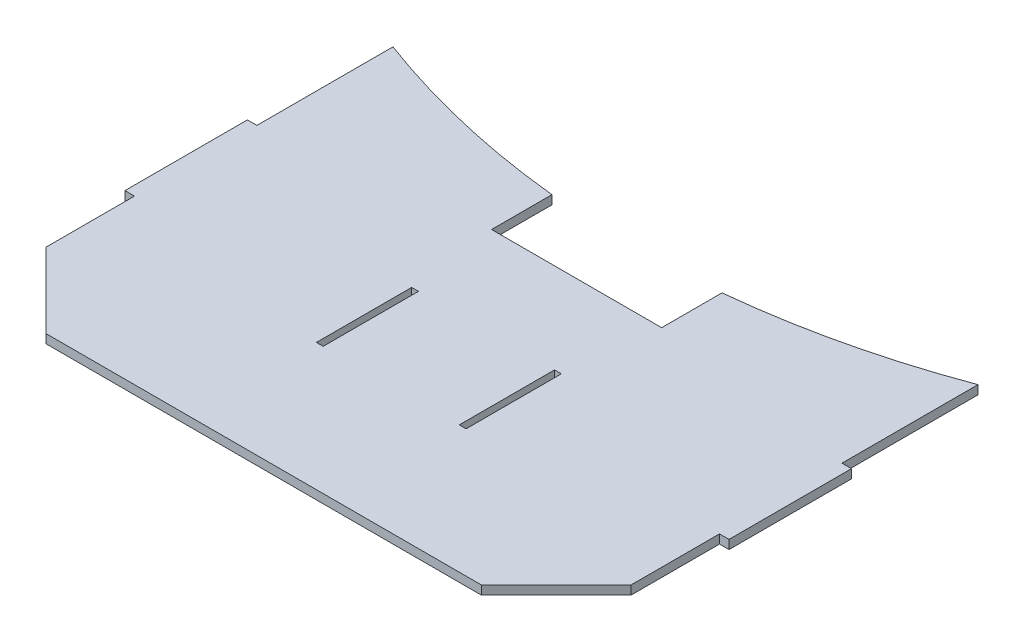
ISO-10303-21;
HEADER;
FILE_DESCRIPTION(('STEP AP214'),'2;1');
FILE_NAME('part.step','',(''),(''),'','','');
FILE_SCHEMA(('AUTOMOTIVE_DESIGN { 1 0 10303 214 1 1 1 1 }'));
ENDSEC;
DATA;
#1=APPLICATION_CONTEXT('core data for automotive mechanical design processes');
#2=APPLICATION_PROTOCOL_DEFINITION('international standard','automotive_design',2000,#1);
#3=PRODUCT_CONTEXT('',#1,'mechanical');
#4=PRODUCT('Part','Part','',(#3));
#5=PRODUCT_RELATED_PRODUCT_CATEGORY('part','',(#4));
#6=PRODUCT_DEFINITION_FORMATION('','',#4);
#7=PRODUCT_DEFINITION_CONTEXT('part definition',#1,'design');
#8=PRODUCT_DEFINITION('design','',#6,#7);
#9=PRODUCT_DEFINITION_SHAPE('','',#8);
#10=(LENGTH_UNIT() NAMED_UNIT(*) SI_UNIT(.MILLI.,.METRE.));
#11=(NAMED_UNIT(*) PLANE_ANGLE_UNIT() SI_UNIT($,.RADIAN.));
#12=(NAMED_UNIT(*) SI_UNIT($,.STERADIAN.) SOLID_ANGLE_UNIT());
#13=UNCERTAINTY_MEASURE_WITH_UNIT(LENGTH_MEASURE(1.E-05),#10,'distance_accuracy_value','');
#14=(GEOMETRIC_REPRESENTATION_CONTEXT(3) GLOBAL_UNCERTAINTY_ASSIGNED_CONTEXT((#13)) GLOBAL_UNIT_ASSIGNED_CONTEXT((#10,
#11,#12)) REPRESENTATION_CONTEXT('',''));
#15=CARTESIAN_POINT('',(0.,0.,0.));
#16=DIRECTION('',(0.,0.,1.));
#17=DIRECTION('',(1.,0.,0.));
#18=AXIS2_PLACEMENT_3D('',#15,#16,#17);
#19=CARTESIAN_POINT('',(0.,1.3,0.));
#20=DIRECTION('',(0.,1.,0.));
#21=DIRECTION('',(0.,0.,1.));
#22=AXIS2_PLACEMENT_3D('',#19,#20,#21);
#23=PLANE('',#22);
#24=DIRECTION('',(0.,0.,1.));
#25=VECTOR('',#24,1.);
#26=CARTESIAN_POINT('',(-11.,1.3,-1.75));
#27=LINE('',#26,#25);
#28=CARTESIAN_POINT('',(-11.,1.3,-1.75));
#29=VERTEX_POINT('',#28);
#30=CARTESIAN_POINT('',(-11.,1.3,12.25));
#31=VERTEX_POINT('',#30);
#32=EDGE_CURVE('E56',#29,#31,#27,.T.);
#33=ORIENTED_EDGE('',*,*,#32,.F.);
#34=DIRECTION('',(-1.,0.,0.));
#35=VECTOR('',#34,1.);
#36=CARTESIAN_POINT('',(-11.,1.3,-1.75));
#37=LINE('',#36,#35);
#38=CARTESIAN_POINT('',(-9.99999999999999,1.3,-1.75));
#39=VERTEX_POINT('',#38);
#40=EDGE_CURVE('E235',#39,#29,#37,.T.);
#41=ORIENTED_EDGE('',*,*,#40,.F.);
#42=DIRECTION('',(0.,0.,-1.));
#43=VECTOR('',#42,1.);
#44=CARTESIAN_POINT('',(-9.99999999999999,1.3,-1.75));
#45=LINE('',#44,#43);
#46=CARTESIAN_POINT('',(-10.,1.3,12.25));
#47=VERTEX_POINT('',#46);
#48=EDGE_CURVE('E238',#47,#39,#45,.T.);
#49=ORIENTED_EDGE('',*,*,#48,.F.);
#50=DIRECTION('',(1.,0.,0.));
#51=VECTOR('',#50,1.);
#52=CARTESIAN_POINT('',(-11.,1.3,12.25));
#53=LINE('',#52,#51);
#54=EDGE_CURVE('E244',#31,#47,#53,.T.);
#55=ORIENTED_EDGE('',*,*,#54,.F.);
#56=EDGE_LOOP('',(#33,#41,#49,#55));
#57=FACE_BOUND('',#56,.T.);
#58=DIRECTION('',(0.,0.,1.));
#59=VECTOR('',#58,1.);
#60=CARTESIAN_POINT('',(10.,1.3,-1.75));
#61=LINE('',#60,#59);
#62=CARTESIAN_POINT('',(10.,1.3,-1.75));
#63=VERTEX_POINT('',#62);
#64=CARTESIAN_POINT('',(10.,1.3,12.25));
#65=VERTEX_POINT('',#64);
#66=EDGE_CURVE('E64',#63,#65,#61,.T.);
#67=ORIENTED_EDGE('',*,*,#66,.F.);
#68=DIRECTION('',(-1.,0.,0.));
#69=VECTOR('',#68,1.);
#70=CARTESIAN_POINT('',(10.,1.3,-1.75));
#71=LINE('',#70,#69);
#72=CARTESIAN_POINT('',(11.,1.3,-1.75));
#73=VERTEX_POINT('',#72);
#74=EDGE_CURVE('E263',#73,#63,#71,.T.);
#75=ORIENTED_EDGE('',*,*,#74,.F.);
#76=DIRECTION('',(0.,0.,-1.));
#77=VECTOR('',#76,1.);
#78=CARTESIAN_POINT('',(11.,1.3,-1.75));
#79=LINE('',#78,#77);
#80=CARTESIAN_POINT('',(11.,1.3,12.25));
#81=VERTEX_POINT('',#80);
#82=EDGE_CURVE('E266',#81,#73,#79,.T.);
#83=ORIENTED_EDGE('',*,*,#82,.F.);
#84=DIRECTION('',(1.,0.,0.));
#85=VECTOR('',#84,1.);
#86=CARTESIAN_POINT('',(10.,1.3,12.25));
#87=LINE('',#86,#85);
#88=EDGE_CURVE('E270',#65,#81,#87,.T.);
#89=ORIENTED_EDGE('',*,*,#88,.F.);
#90=EDGE_LOOP('',(#67,#75,#83,#89));
#91=FACE_BOUND('',#90,.T.);
#92=CARTESIAN_POINT('',(0.,1.3,-146.119771667613));
#93=DIRECTION('',(0.,1.,0.));
#94=DIRECTION('',(0.,0.,1.));
#95=AXIS2_PLACEMENT_3D('',#92,#93,#94);
#96=CIRCLE('',#95,122.8884121014);
#97=CARTESIAN_POINT('',(12.5,1.3,-23.8687519221591));
#98=VERTEX_POINT('',#97);
#99=CARTESIAN_POINT('',(43.,1.3,-31.));
#100=VERTEX_POINT('',#99);
#101=EDGE_CURVE('E250',#98,#100,#96,.T.);
#102=ORIENTED_EDGE('',*,*,#101,.F.);
#103=DIRECTION('',(0.,0.,1.));
#104=VECTOR('',#103,1.);
#105=CARTESIAN_POINT('',(12.5,1.3,-31.));
#106=LINE('',#105,#104);
#107=CARTESIAN_POINT('',(12.5,1.3,-15.));
#108=VERTEX_POINT('',#107);
#109=EDGE_CURVE('E293',#98,#108,#106,.T.);
#110=ORIENTED_EDGE('',*,*,#109,.T.);
#111=DIRECTION('',(1.,0.,0.));
#112=VECTOR('',#111,1.);
#113=CARTESIAN_POINT('',(-12.5,1.3,-15.));
#114=LINE('',#113,#112);
#115=CARTESIAN_POINT('',(-12.5,1.3,-15.));
#116=VERTEX_POINT('',#115);
#117=EDGE_CURVE('E295',#116,#108,#114,.T.);
#118=ORIENTED_EDGE('',*,*,#117,.F.);
#119=DIRECTION('',(0.,0.,1.));
#120=VECTOR('',#119,1.);
#121=CARTESIAN_POINT('',(-12.5,1.3,-31.));
#122=LINE('',#121,#120);
#123=CARTESIAN_POINT('',(-12.5,1.3,-23.8687519221591));
#124=VERTEX_POINT('',#123);
#125=EDGE_CURVE('E299',#124,#116,#122,.T.);
#126=ORIENTED_EDGE('',*,*,#125,.F.);
#127=CARTESIAN_POINT('',(-43.,1.3,-31.));
#128=VERTEX_POINT('',#127);
#129=EDGE_CURVE('E289',#128,#124,#96,.T.);
#130=ORIENTED_EDGE('',*,*,#129,.F.);
#131=DIRECTION('',(0.,0.,1.));
#132=VECTOR('',#131,1.);
#133=CARTESIAN_POINT('',(-43.,1.3,-31.));
#134=LINE('',#133,#132);
#135=CARTESIAN_POINT('',(-43.,1.3,-11.));
#136=VERTEX_POINT('',#135);
#137=EDGE_CURVE('E366',#128,#136,#134,.T.);
#138=ORIENTED_EDGE('',*,*,#137,.T.);
#139=DIRECTION('',(-1.,0.,0.));
#140=VECTOR('',#139,1.);
#141=CARTESIAN_POINT('',(-43.,1.3,-11.));
#142=LINE('',#141,#140);
#143=CARTESIAN_POINT('',(-44.4,1.3,-11.));
#144=VERTEX_POINT('',#143);
#145=EDGE_CURVE('E315',#136,#144,#142,.T.);
#146=ORIENTED_EDGE('',*,*,#145,.T.);
#147=DIRECTION('',(0.,0.,-1.));
#148=VECTOR('',#147,1.);
#149=CARTESIAN_POINT('',(-44.4,1.3,7.));
#150=LINE('',#149,#148);
#151=CARTESIAN_POINT('',(-44.4,1.3,7.));
#152=VERTEX_POINT('',#151);
#153=EDGE_CURVE('E334',#152,#144,#150,.T.);
#154=ORIENTED_EDGE('',*,*,#153,.F.);
#155=DIRECTION('',(-1.,0.,0.));
#156=VECTOR('',#155,1.);
#157=CARTESIAN_POINT('',(-43.,1.3,7.));
#158=LINE('',#157,#156);
#159=CARTESIAN_POINT('',(-43.,1.3,7.));
#160=VERTEX_POINT('',#159);
#161=EDGE_CURVE('E326',#160,#152,#158,.T.);
#162=ORIENTED_EDGE('',*,*,#161,.F.);
#163=CARTESIAN_POINT('',(-43.,1.3,20.));
#164=VERTEX_POINT('',#163);
#165=EDGE_CURVE('E370',#160,#164,#134,.T.);
#166=ORIENTED_EDGE('',*,*,#165,.T.);
#167=DIRECTION('',(0.707106781186547,0.,0.707106781186548));
#168=VECTOR('',#167,1.);
#169=CARTESIAN_POINT('',(-43.,1.3,20.));
#170=LINE('',#169,#168);
#171=CARTESIAN_POINT('',(-32.,1.3,31.));
#172=VERTEX_POINT('',#171);
#173=EDGE_CURVE('E369',#164,#172,#170,.T.);
#174=ORIENTED_EDGE('',*,*,#173,.T.);
#175=DIRECTION('',(1.,0.,0.));
#176=VECTOR('',#175,1.);
#177=CARTESIAN_POINT('',(-32.,1.3,31.));
#178=LINE('',#177,#176);
#179=CARTESIAN_POINT('',(32.,1.3,31.));
#180=VERTEX_POINT('',#179);
#181=EDGE_CURVE('E372',#172,#180,#178,.T.);
#182=ORIENTED_EDGE('',*,*,#181,.T.);
#183=DIRECTION('',(0.707106781186547,0.,-0.707106781186548));
#184=VECTOR('',#183,1.);
#185=CARTESIAN_POINT('',(43.,1.3,20.));
#186=LINE('',#185,#184);
#187=CARTESIAN_POINT('',(43.,1.3,20.));
#188=VERTEX_POINT('',#187);
#189=EDGE_CURVE('E374',#180,#188,#186,.T.);
#190=ORIENTED_EDGE('',*,*,#189,.T.);
#191=DIRECTION('',(0.,0.,-1.));
#192=VECTOR('',#191,1.);
#193=CARTESIAN_POINT('',(43.,1.3,-31.));
#194=LINE('',#193,#192);
#195=CARTESIAN_POINT('',(43.,1.3,7.));
#196=VERTEX_POINT('',#195);
#197=EDGE_CURVE('E377',#188,#196,#194,.T.);
#198=ORIENTED_EDGE('',*,*,#197,.T.);
#199=DIRECTION('',(1.,0.,0.));
#200=VECTOR('',#199,1.);
#201=CARTESIAN_POINT('',(43.,1.3,7.));
#202=LINE('',#201,#200);
#203=CARTESIAN_POINT('',(44.4,1.3,7.));
#204=VERTEX_POINT('',#203);
#205=EDGE_CURVE('E339',#196,#204,#202,.T.);
#206=ORIENTED_EDGE('',*,*,#205,.T.);
#207=DIRECTION('',(0.,0.,-1.));
#208=VECTOR('',#207,1.);
#209=CARTESIAN_POINT('',(44.4,1.3,7.));
#210=LINE('',#209,#208);
#211=CARTESIAN_POINT('',(44.4,1.3,-11.));
#212=VERTEX_POINT('',#211);
#213=EDGE_CURVE('E342',#204,#212,#210,.T.);
#214=ORIENTED_EDGE('',*,*,#213,.T.);
#215=DIRECTION('',(1.,0.,0.));
#216=VECTOR('',#215,1.);
#217=CARTESIAN_POINT('',(43.,1.3,-11.));
#218=LINE('',#217,#216);
#219=CARTESIAN_POINT('',(43.,1.3,-11.));
#220=VERTEX_POINT('',#219);
#221=EDGE_CURVE('E345',#220,#212,#218,.T.);
#222=ORIENTED_EDGE('',*,*,#221,.F.);
#223=EDGE_CURVE('E376',#220,#100,#194,.T.);
#224=ORIENTED_EDGE('',*,*,#223,.T.);
#225=EDGE_LOOP('',(#102,#110,#118,#126,#130,#138,#146,#154,#162,#166,#174,#182,#190,#198,#206,
#214,#222,#224));
#226=FACE_BOUND('',#225,.T.);
#227=ADVANCED_FACE('F41',(#57,#91,#226),#23,.T.);
#228=CARTESIAN_POINT('',(0.,0.,0.));
#229=DIRECTION('',(0.,1.,0.));
#230=DIRECTION('',(0.,0.,1.));
#231=AXIS2_PLACEMENT_3D('',#228,#229,#230);
#232=PLANE('',#231);
#233=DIRECTION('',(-1.,0.,0.));
#234=VECTOR('',#233,1.);
#235=CARTESIAN_POINT('',(-11.,0.,-1.75));
#236=LINE('',#235,#234);
#237=CARTESIAN_POINT('',(-9.99999999999999,0.,-1.75));
#238=VERTEX_POINT('',#237);
#239=CARTESIAN_POINT('',(-11.,0.,-1.75));
#240=VERTEX_POINT('',#239);
#241=EDGE_CURVE('E222',#238,#240,#236,.T.);
#242=ORIENTED_EDGE('',*,*,#241,.T.);
#243=DIRECTION('',(0.,0.,1.));
#244=VECTOR('',#243,1.);
#245=CARTESIAN_POINT('',(-11.,0.,-1.75));
#246=LINE('',#245,#244);
#247=CARTESIAN_POINT('',(-11.,0.,12.25));
#248=VERTEX_POINT('',#247);
#249=EDGE_CURVE('E216',#240,#248,#246,.T.);
#250=ORIENTED_EDGE('',*,*,#249,.T.);
#251=DIRECTION('',(1.,0.,0.));
#252=VECTOR('',#251,1.);
#253=CARTESIAN_POINT('',(-11.,0.,12.25));
#254=LINE('',#253,#252);
#255=CARTESIAN_POINT('',(-10.,0.,12.25));
#256=VERTEX_POINT('',#255);
#257=EDGE_CURVE('E226',#248,#256,#254,.T.);
#258=ORIENTED_EDGE('',*,*,#257,.T.);
#259=DIRECTION('',(0.,0.,-1.));
#260=VECTOR('',#259,1.);
#261=CARTESIAN_POINT('',(-9.99999999999999,0.,-1.75));
#262=LINE('',#261,#260);
#263=EDGE_CURVE('E230',#256,#238,#262,.T.);
#264=ORIENTED_EDGE('',*,*,#263,.T.);
#265=EDGE_LOOP('',(#242,#250,#258,#264));
#266=FACE_BOUND('',#265,.T.);
#267=DIRECTION('',(-1.,0.,0.));
#268=VECTOR('',#267,1.);
#269=CARTESIAN_POINT('',(10.,0.,-1.75));
#270=LINE('',#269,#268);
#271=CARTESIAN_POINT('',(11.,0.,-1.75));
#272=VERTEX_POINT('',#271);
#273=CARTESIAN_POINT('',(10.,0.,-1.75));
#274=VERTEX_POINT('',#273);
#275=EDGE_CURVE('E256',#272,#274,#270,.T.);
#276=ORIENTED_EDGE('',*,*,#275,.T.);
#277=DIRECTION('',(0.,0.,1.));
#278=VECTOR('',#277,1.);
#279=CARTESIAN_POINT('',(10.,0.,-1.75));
#280=LINE('',#279,#278);
#281=CARTESIAN_POINT('',(10.,0.,12.25));
#282=VERTEX_POINT('',#281);
#283=EDGE_CURVE('E267',#274,#282,#280,.T.);
#284=ORIENTED_EDGE('',*,*,#283,.T.);
#285=DIRECTION('',(1.,0.,0.));
#286=VECTOR('',#285,1.);
#287=CARTESIAN_POINT('',(10.,0.,12.25));
#288=LINE('',#287,#286);
#289=CARTESIAN_POINT('',(11.,0.,12.25));
#290=VERTEX_POINT('',#289);
#291=EDGE_CURVE('E279',#282,#290,#288,.T.);
#292=ORIENTED_EDGE('',*,*,#291,.T.);
#293=DIRECTION('',(0.,0.,-1.));
#294=VECTOR('',#293,1.);
#295=CARTESIAN_POINT('',(11.,0.,-1.75));
#296=LINE('',#295,#294);
#297=EDGE_CURVE('E276',#290,#272,#296,.T.);
#298=ORIENTED_EDGE('',*,*,#297,.T.);
#299=EDGE_LOOP('',(#276,#284,#292,#298));
#300=FACE_BOUND('',#299,.T.);
#301=DIRECTION('',(0.,0.,1.));
#302=VECTOR('',#301,1.);
#303=CARTESIAN_POINT('',(12.5,0.,-31.));
#304=LINE('',#303,#302);
#305=CARTESIAN_POINT('',(12.5,0.,-23.8687519221591));
#306=VERTEX_POINT('',#305);
#307=CARTESIAN_POINT('',(12.5,0.,-15.));
#308=VERTEX_POINT('',#307);
#309=EDGE_CURVE('E292',#306,#308,#304,.T.);
#310=ORIENTED_EDGE('',*,*,#309,.F.);
#311=CARTESIAN_POINT('',(0.,0.,-146.119771667613));
#312=DIRECTION('',(0.,1.,0.));
#313=DIRECTION('',(0.,0.,1.));
#314=AXIS2_PLACEMENT_3D('',#311,#312,#313);
#315=CIRCLE('',#314,122.8884121014);
#316=CARTESIAN_POINT('',(43.,0.,-31.));
#317=VERTEX_POINT('',#316);
#318=EDGE_CURVE('E288',#306,#317,#315,.T.);
#319=ORIENTED_EDGE('',*,*,#318,.T.);
#320=DIRECTION('',(0.,0.,-1.));
#321=VECTOR('',#320,1.);
#322=CARTESIAN_POINT('',(43.,0.,-31.));
#323=LINE('',#322,#321);
#324=CARTESIAN_POINT('',(43.,0.,-11.));
#325=VERTEX_POINT('',#324);
#326=EDGE_CURVE('E390',#325,#317,#323,.T.);
#327=ORIENTED_EDGE('',*,*,#326,.F.);
#328=DIRECTION('',(1.,0.,0.));
#329=VECTOR('',#328,1.);
#330=CARTESIAN_POINT('',(43.,0.,-11.));
#331=LINE('',#330,#329);
#332=CARTESIAN_POINT('',(44.4,0.,-11.));
#333=VERTEX_POINT('',#332);
#334=EDGE_CURVE('E343',#325,#333,#331,.T.);
#335=ORIENTED_EDGE('',*,*,#334,.T.);
#336=DIRECTION('',(0.,0.,-1.));
#337=VECTOR('',#336,1.);
#338=CARTESIAN_POINT('',(44.4,0.,7.));
#339=LINE('',#338,#337);
#340=CARTESIAN_POINT('',(44.4,0.,7.));
#341=VERTEX_POINT('',#340);
#342=EDGE_CURVE('E351',#341,#333,#339,.T.);
#343=ORIENTED_EDGE('',*,*,#342,.F.);
#344=DIRECTION('',(1.,0.,0.));
#345=VECTOR('',#344,1.);
#346=CARTESIAN_POINT('',(43.,0.,7.));
#347=LINE('',#346,#345);
#348=CARTESIAN_POINT('',(43.,0.,7.));
#349=VERTEX_POINT('',#348);
#350=EDGE_CURVE('E332',#349,#341,#347,.T.);
#351=ORIENTED_EDGE('',*,*,#350,.F.);
#352=CARTESIAN_POINT('',(43.,0.,20.));
#353=VERTEX_POINT('',#352);
#354=EDGE_CURVE('E391',#353,#349,#323,.T.);
#355=ORIENTED_EDGE('',*,*,#354,.F.);
#356=DIRECTION('',(0.707106781186547,0.,-0.707106781186548));
#357=VECTOR('',#356,1.);
#358=CARTESIAN_POINT('',(43.,0.,20.));
#359=LINE('',#358,#357);
#360=CARTESIAN_POINT('',(32.,0.,31.));
#361=VERTEX_POINT('',#360);
#362=EDGE_CURVE('E388',#361,#353,#359,.T.);
#363=ORIENTED_EDGE('',*,*,#362,.F.);
#364=DIRECTION('',(1.,0.,0.));
#365=VECTOR('',#364,1.);
#366=CARTESIAN_POINT('',(-32.,0.,31.));
#367=LINE('',#366,#365);
#368=CARTESIAN_POINT('',(-32.,0.,31.));
#369=VERTEX_POINT('',#368);
#370=EDGE_CURVE('E386',#369,#361,#367,.T.);
#371=ORIENTED_EDGE('',*,*,#370,.F.);
#372=DIRECTION('',(0.707106781186547,0.,0.707106781186548));
#373=VECTOR('',#372,1.);
#374=CARTESIAN_POINT('',(-43.,0.,20.));
#375=LINE('',#374,#373);
#376=CARTESIAN_POINT('',(-43.,0.,20.));
#377=VERTEX_POINT('',#376);
#378=EDGE_CURVE('E384',#377,#369,#375,.T.);
#379=ORIENTED_EDGE('',*,*,#378,.F.);
#380=DIRECTION('',(0.,0.,1.));
#381=VECTOR('',#380,1.);
#382=CARTESIAN_POINT('',(-43.,0.,-31.));
#383=LINE('',#382,#381);
#384=CARTESIAN_POINT('',(-43.,0.,7.));
#385=VERTEX_POINT('',#384);
#386=EDGE_CURVE('E365',#385,#377,#383,.T.);
#387=ORIENTED_EDGE('',*,*,#386,.F.);
#388=DIRECTION('',(-1.,0.,0.));
#389=VECTOR('',#388,1.);
#390=CARTESIAN_POINT('',(-43.,0.,7.));
#391=LINE('',#390,#389);
#392=CARTESIAN_POINT('',(-44.4,0.,7.));
#393=VERTEX_POINT('',#392);
#394=EDGE_CURVE('E329',#385,#393,#391,.T.);
#395=ORIENTED_EDGE('',*,*,#394,.T.);
#396=DIRECTION('',(0.,0.,-1.));
#397=VECTOR('',#396,1.);
#398=CARTESIAN_POINT('',(-44.4,0.,7.));
#399=LINE('',#398,#397);
#400=CARTESIAN_POINT('',(-44.4,0.,-11.));
#401=VERTEX_POINT('',#400);
#402=EDGE_CURVE('E325',#393,#401,#399,.T.);
#403=ORIENTED_EDGE('',*,*,#402,.T.);
#404=DIRECTION('',(-1.,0.,0.));
#405=VECTOR('',#404,1.);
#406=CARTESIAN_POINT('',(-43.,0.,-11.));
#407=LINE('',#406,#405);
#408=CARTESIAN_POINT('',(-43.,0.,-11.));
#409=VERTEX_POINT('',#408);
#410=EDGE_CURVE('E322',#409,#401,#407,.T.);
#411=ORIENTED_EDGE('',*,*,#410,.F.);
#412=CARTESIAN_POINT('',(-43.,0.,-31.));
#413=VERTEX_POINT('',#412);
#414=EDGE_CURVE('E381',#413,#409,#383,.T.);
#415=ORIENTED_EDGE('',*,*,#414,.F.);
#416=CARTESIAN_POINT('',(-12.5,0.,-23.8687519221591));
#417=VERTEX_POINT('',#416);
#418=EDGE_CURVE('E284',#413,#417,#315,.T.);
#419=ORIENTED_EDGE('',*,*,#418,.T.);
#420=DIRECTION('',(0.,0.,1.));
#421=VECTOR('',#420,1.);
#422=CARTESIAN_POINT('',(-12.5,0.,-31.));
#423=LINE('',#422,#421);
#424=CARTESIAN_POINT('',(-12.5,0.,-15.));
#425=VERTEX_POINT('',#424);
#426=EDGE_CURVE('E296',#417,#425,#423,.T.);
#427=ORIENTED_EDGE('',*,*,#426,.T.);
#428=DIRECTION('',(1.,0.,0.));
#429=VECTOR('',#428,1.);
#430=CARTESIAN_POINT('',(-12.5,0.,-15.));
#431=LINE('',#430,#429);
#432=EDGE_CURVE('E303',#425,#308,#431,.T.);
#433=ORIENTED_EDGE('',*,*,#432,.T.);
#434=EDGE_LOOP('',(#310,#319,#327,#335,#343,#351,#355,#363,#371,#379,#387,#395,#403,#411,#415,
#419,#427,#433));
#435=FACE_BOUND('',#434,.T.);
#436=ADVANCED_FACE('F232',(#266,#300,#435),#232,.F.);
#437=CARTESIAN_POINT('',(-43.,1.3,-31.));
#438=DIRECTION('',(1.,0.,0.));
#439=DIRECTION('',(0.,0.,-1.));
#440=AXIS2_PLACEMENT_3D('',#437,#438,#439);
#441=PLANE('',#440);
#442=DIRECTION('',(0.,-1.,0.));
#443=VECTOR('',#442,1.);
#444=CARTESIAN_POINT('',(-43.,1.3,-11.));
#445=LINE('',#444,#443);
#446=EDGE_CURVE('E318',#136,#409,#445,.T.);
#447=ORIENTED_EDGE('',*,*,#446,.F.);
#448=ORIENTED_EDGE('',*,*,#137,.F.);
#449=DIRECTION('',(0.,-1.,0.));
#450=VECTOR('',#449,1.);
#451=CARTESIAN_POINT('',(-43.,1.3,-31.));
#452=LINE('',#451,#450);
#453=EDGE_CURVE('E380',#128,#413,#452,.T.);
#454=ORIENTED_EDGE('',*,*,#453,.T.);
#455=ORIENTED_EDGE('',*,*,#414,.T.);
#456=EDGE_LOOP('',(#447,#448,#454,#455));
#457=FACE_BOUND('',#456,.T.);
#458=ADVANCED_FACE('F447',(#457),#441,.F.);
#459=CARTESIAN_POINT('',(43.,1.3,-31.));
#460=DIRECTION('',(-1.,0.,0.));
#461=DIRECTION('',(0.,0.,1.));
#462=AXIS2_PLACEMENT_3D('',#459,#460,#461);
#463=PLANE('',#462);
#464=DIRECTION('',(0.,-1.,0.));
#465=VECTOR('',#464,1.);
#466=CARTESIAN_POINT('',(43.,1.3,7.));
#467=LINE('',#466,#465);
#468=EDGE_CURVE('E348',#196,#349,#467,.T.);
#469=ORIENTED_EDGE('',*,*,#468,.F.);
#470=ORIENTED_EDGE('',*,*,#197,.F.);
#471=DIRECTION('',(0.,-1.,0.));
#472=VECTOR('',#471,1.);
#473=CARTESIAN_POINT('',(43.,1.3,20.));
#474=LINE('',#473,#472);
#475=EDGE_CURVE('E398',#188,#353,#474,.T.);
#476=ORIENTED_EDGE('',*,*,#475,.T.);
#477=ORIENTED_EDGE('',*,*,#354,.T.);
#478=EDGE_LOOP('',(#469,#470,#476,#477));
#479=FACE_BOUND('',#478,.T.);
#480=ADVANCED_FACE('F487',(#479),#463,.F.);
#481=ORIENTED_EDGE('',*,*,#165,.F.);
#482=DIRECTION('',(0.,-1.,0.));
#483=VECTOR('',#482,1.);
#484=CARTESIAN_POINT('',(-43.,1.3,7.));
#485=LINE('',#484,#483);
#486=EDGE_CURVE('E310',#160,#385,#485,.T.);
#487=ORIENTED_EDGE('',*,*,#486,.T.);
#488=ORIENTED_EDGE('',*,*,#386,.T.);
#489=DIRECTION('',(0.,-1.,0.));
#490=VECTOR('',#489,1.);
#491=CARTESIAN_POINT('',(-43.,1.3,20.));
#492=LINE('',#491,#490);
#493=EDGE_CURVE('E49',#164,#377,#492,.T.);
#494=ORIENTED_EDGE('',*,*,#493,.F.);
#495=EDGE_LOOP('',(#481,#487,#488,#494));
#496=FACE_BOUND('',#495,.T.);
#497=ADVANCED_FACE('F43',(#496),#441,.F.);
#498=CARTESIAN_POINT('',(-43.,1.3,20.));
#499=DIRECTION('',(0.707106781186548,0.,-0.707106781186547));
#500=DIRECTION('',(-0.707106781186547,0.,-0.707106781186548));
#501=AXIS2_PLACEMENT_3D('',#498,#499,#500);
#502=PLANE('',#501);
#503=ORIENTED_EDGE('',*,*,#378,.T.);
#504=DIRECTION('',(0.,-1.,0.));
#505=VECTOR('',#504,1.);
#506=CARTESIAN_POINT('',(-32.,1.3,31.));
#507=LINE('',#506,#505);
#508=EDGE_CURVE('E404',#172,#369,#507,.T.);
#509=ORIENTED_EDGE('',*,*,#508,.F.);
#510=ORIENTED_EDGE('',*,*,#173,.F.);
#511=ORIENTED_EDGE('',*,*,#493,.T.);
#512=EDGE_LOOP('',(#503,#509,#510,#511));
#513=FACE_BOUND('',#512,.T.);
#514=ADVANCED_FACE('F410',(#513),#502,.F.);
#515=CARTESIAN_POINT('',(-32.,1.3,31.));
#516=DIRECTION('',(0.,0.,-1.));
#517=DIRECTION('',(-1.,0.,0.));
#518=AXIS2_PLACEMENT_3D('',#515,#516,#517);
#519=PLANE('',#518);
#520=ORIENTED_EDGE('',*,*,#370,.T.);
#521=DIRECTION('',(0.,-1.,0.));
#522=VECTOR('',#521,1.);
#523=CARTESIAN_POINT('',(32.,1.3,31.));
#524=LINE('',#523,#522);
#525=EDGE_CURVE('E401',#180,#361,#524,.T.);
#526=ORIENTED_EDGE('',*,*,#525,.F.);
#527=ORIENTED_EDGE('',*,*,#181,.F.);
#528=ORIENTED_EDGE('',*,*,#508,.T.);
#529=EDGE_LOOP('',(#520,#526,#527,#528));
#530=FACE_BOUND('',#529,.T.);
#531=ADVANCED_FACE('F423',(#530),#519,.F.);
#532=CARTESIAN_POINT('',(43.,1.3,20.));
#533=DIRECTION('',(-0.707106781186548,0.,-0.707106781186547));
#534=DIRECTION('',(-0.707106781186547,0.,0.707106781186548));
#535=AXIS2_PLACEMENT_3D('',#532,#533,#534);
#536=PLANE('',#535);
#537=ORIENTED_EDGE('',*,*,#362,.T.);
#538=ORIENTED_EDGE('',*,*,#475,.F.);
#539=ORIENTED_EDGE('',*,*,#189,.F.);
#540=ORIENTED_EDGE('',*,*,#525,.T.);
#541=EDGE_LOOP('',(#537,#538,#539,#540));
#542=FACE_BOUND('',#541,.T.);
#543=ADVANCED_FACE('F427',(#542),#536,.F.);
#544=ORIENTED_EDGE('',*,*,#223,.F.);
#545=DIRECTION('',(0.,-1.,0.));
#546=VECTOR('',#545,1.);
#547=CARTESIAN_POINT('',(43.,1.3,-11.));
#548=LINE('',#547,#546);
#549=EDGE_CURVE('E357',#220,#325,#548,.T.);
#550=ORIENTED_EDGE('',*,*,#549,.T.);
#551=ORIENTED_EDGE('',*,*,#326,.T.);
#552=DIRECTION('',(0.,-1.,0.));
#553=VECTOR('',#552,1.);
#554=CARTESIAN_POINT('',(43.,1.3,-31.));
#555=LINE('',#554,#553);
#556=EDGE_CURVE('E396',#100,#317,#555,.T.);
#557=ORIENTED_EDGE('',*,*,#556,.F.);
#558=EDGE_LOOP('',(#544,#550,#551,#557));
#559=FACE_BOUND('',#558,.T.);
#560=ADVANCED_FACE('F474',(#559),#463,.F.);
#561=CARTESIAN_POINT('',(43.,1.3,7.));
#562=DIRECTION('',(0.,0.,-1.));
#563=DIRECTION('',(-1.,0.,0.));
#564=AXIS2_PLACEMENT_3D('',#561,#562,#563);
#565=PLANE('',#564);
#566=ORIENTED_EDGE('',*,*,#350,.T.);
#567=DIRECTION('',(0.,-1.,0.));
#568=VECTOR('',#567,1.);
#569=CARTESIAN_POINT('',(44.4,1.3,7.));
#570=LINE('',#569,#568);
#571=EDGE_CURVE('E362',#204,#341,#570,.T.);
#572=ORIENTED_EDGE('',*,*,#571,.F.);
#573=ORIENTED_EDGE('',*,*,#205,.F.);
#574=ORIENTED_EDGE('',*,*,#468,.T.);
#575=EDGE_LOOP('',(#566,#572,#573,#574));
#576=FACE_BOUND('',#575,.T.);
#577=ADVANCED_FACE('F484',(#576),#565,.F.);
#578=CARTESIAN_POINT('',(44.4,1.3,7.));
#579=DIRECTION('',(-1.,0.,0.));
#580=DIRECTION('',(0.,0.,1.));
#581=AXIS2_PLACEMENT_3D('',#578,#579,#580);
#582=PLANE('',#581);
#583=ORIENTED_EDGE('',*,*,#342,.T.);
#584=DIRECTION('',(0.,-1.,0.));
#585=VECTOR('',#584,1.);
#586=CARTESIAN_POINT('',(44.4,1.3,-11.));
#587=LINE('',#586,#585);
#588=EDGE_CURVE('E360',#212,#333,#587,.T.);
#589=ORIENTED_EDGE('',*,*,#588,.F.);
#590=ORIENTED_EDGE('',*,*,#213,.F.);
#591=ORIENTED_EDGE('',*,*,#571,.T.);
#592=EDGE_LOOP('',(#583,#589,#590,#591));
#593=FACE_BOUND('',#592,.T.);
#594=ADVANCED_FACE('F481',(#593),#582,.F.);
#595=CARTESIAN_POINT('',(43.,1.3,-11.));
#596=DIRECTION('',(0.,0.,-1.));
#597=DIRECTION('',(-1.,0.,0.));
#598=AXIS2_PLACEMENT_3D('',#595,#596,#597);
#599=PLANE('',#598);
#600=ORIENTED_EDGE('',*,*,#334,.F.);
#601=ORIENTED_EDGE('',*,*,#549,.F.);
#602=ORIENTED_EDGE('',*,*,#221,.T.);
#603=ORIENTED_EDGE('',*,*,#588,.T.);
#604=EDGE_LOOP('',(#600,#601,#602,#603));
#605=FACE_BOUND('',#604,.T.);
#606=ADVANCED_FACE('F478',(#605),#599,.T.);
#607=CARTESIAN_POINT('',(-43.,1.3,7.));
#608=DIRECTION('',(0.,0.,1.));
#609=DIRECTION('',(1.,0.,0.));
#610=AXIS2_PLACEMENT_3D('',#607,#608,#609);
#611=PLANE('',#610);
#612=ORIENTED_EDGE('',*,*,#394,.F.);
#613=ORIENTED_EDGE('',*,*,#486,.F.);
#614=ORIENTED_EDGE('',*,*,#161,.T.);
#615=DIRECTION('',(0.,-1.,0.));
#616=VECTOR('',#615,1.);
#617=CARTESIAN_POINT('',(-44.4,1.3,7.));
#618=LINE('',#617,#616);
#619=EDGE_CURVE('E313',#152,#393,#618,.T.);
#620=ORIENTED_EDGE('',*,*,#619,.T.);
#621=EDGE_LOOP('',(#612,#613,#614,#620));
#622=FACE_BOUND('',#621,.T.);
#623=ADVANCED_FACE('F435',(#622),#611,.T.);
#624=CARTESIAN_POINT('',(-43.,1.3,-11.));
#625=DIRECTION('',(0.,0.,1.));
#626=DIRECTION('',(1.,0.,0.));
#627=AXIS2_PLACEMENT_3D('',#624,#625,#626);
#628=PLANE('',#627);
#629=ORIENTED_EDGE('',*,*,#410,.T.);
#630=DIRECTION('',(0.,-1.,0.));
#631=VECTOR('',#630,1.);
#632=CARTESIAN_POINT('',(-44.4,1.3,-11.));
#633=LINE('',#632,#631);
#634=EDGE_CURVE('E316',#144,#401,#633,.T.);
#635=ORIENTED_EDGE('',*,*,#634,.F.);
#636=ORIENTED_EDGE('',*,*,#145,.F.);
#637=ORIENTED_EDGE('',*,*,#446,.T.);
#638=EDGE_LOOP('',(#629,#635,#636,#637));
#639=FACE_BOUND('',#638,.T.);
#640=ADVANCED_FACE('F443',(#639),#628,.F.);
#641=CARTESIAN_POINT('',(-44.4,1.3,7.));
#642=DIRECTION('',(-1.,0.,0.));
#643=DIRECTION('',(0.,0.,1.));
#644=AXIS2_PLACEMENT_3D('',#641,#642,#643);
#645=PLANE('',#644);
#646=ORIENTED_EDGE('',*,*,#402,.F.);
#647=ORIENTED_EDGE('',*,*,#619,.F.);
#648=ORIENTED_EDGE('',*,*,#153,.T.);
#649=ORIENTED_EDGE('',*,*,#634,.T.);
#650=EDGE_LOOP('',(#646,#647,#648,#649));
#651=FACE_BOUND('',#650,.T.);
#652=ADVANCED_FACE('F440',(#651),#645,.T.);
#653=CARTESIAN_POINT('',(-12.5,1.3,-31.));
#654=DIRECTION('',(1.,0.,0.));
#655=DIRECTION('',(0.,0.,-1.));
#656=AXIS2_PLACEMENT_3D('',#653,#654,#655);
#657=PLANE('',#656);
#658=DIRECTION('',(0.,1.,0.));
#659=VECTOR('',#658,1.);
#660=CARTESIAN_POINT('',(-12.5,0.,-23.8687519221591));
#661=LINE('',#660,#659);
#662=EDGE_CURVE('E287',#124,#417,#661,.F.);
#663=ORIENTED_EDGE('',*,*,#662,.F.);
#664=ORIENTED_EDGE('',*,*,#125,.T.);
#665=DIRECTION('',(0.,-1.,0.));
#666=VECTOR('',#665,1.);
#667=CARTESIAN_POINT('',(-12.5,1.3,-15.));
#668=LINE('',#667,#666);
#669=EDGE_CURVE('E307',#116,#425,#668,.T.);
#670=ORIENTED_EDGE('',*,*,#669,.T.);
#671=ORIENTED_EDGE('',*,*,#426,.F.);
#672=EDGE_LOOP('',(#663,#664,#670,#671));
#673=FACE_BOUND('',#672,.T.);
#674=ADVANCED_FACE('F456',(#673),#657,.T.);
#675=CARTESIAN_POINT('',(-12.5,1.3,-15.));
#676=DIRECTION('',(0.,0.,-1.));
#677=DIRECTION('',(-1.,0.,0.));
#678=AXIS2_PLACEMENT_3D('',#675,#676,#677);
#679=PLANE('',#678);
#680=ORIENTED_EDGE('',*,*,#432,.F.);
#681=ORIENTED_EDGE('',*,*,#669,.F.);
#682=ORIENTED_EDGE('',*,*,#117,.T.);
#683=DIRECTION('',(0.,-1.,0.));
#684=VECTOR('',#683,1.);
#685=CARTESIAN_POINT('',(12.5,1.3,-15.));
#686=LINE('',#685,#684);
#687=EDGE_CURVE('E301',#108,#308,#686,.T.);
#688=ORIENTED_EDGE('',*,*,#687,.T.);
#689=EDGE_LOOP('',(#680,#681,#682,#688));
#690=FACE_BOUND('',#689,.T.);
#691=ADVANCED_FACE('F461',(#690),#679,.T.);
#692=CARTESIAN_POINT('',(12.5,1.3,-31.));
#693=DIRECTION('',(1.,0.,0.));
#694=DIRECTION('',(0.,0.,-1.));
#695=AXIS2_PLACEMENT_3D('',#692,#693,#694);
#696=PLANE('',#695);
#697=ORIENTED_EDGE('',*,*,#109,.F.);
#698=DIRECTION('',(0.,1.,0.));
#699=VECTOR('',#698,1.);
#700=CARTESIAN_POINT('',(12.5,0.,-23.8687519221591));
#701=LINE('',#700,#699);
#702=EDGE_CURVE('E11',#98,#306,#701,.F.);
#703=ORIENTED_EDGE('',*,*,#702,.T.);
#704=ORIENTED_EDGE('',*,*,#309,.T.);
#705=ORIENTED_EDGE('',*,*,#687,.F.);
#706=EDGE_LOOP('',(#697,#703,#704,#705));
#707=FACE_BOUND('',#706,.T.);
#708=ADVANCED_FACE('F465',(#707),#696,.F.);
#709=CARTESIAN_POINT('',(0.,0.,-146.119771667613));
#710=DIRECTION('',(0.,1.,0.));
#711=DIRECTION('',(0.,0.,1.));
#712=AXIS2_PLACEMENT_3D('',#709,#710,#711);
#713=CYLINDRICAL_SURFACE('',#712,122.8884121014);
#714=ORIENTED_EDGE('',*,*,#101,.T.);
#715=ORIENTED_EDGE('',*,*,#556,.T.);
#716=ORIENTED_EDGE('',*,*,#318,.F.);
#717=ORIENTED_EDGE('',*,*,#702,.F.);
#718=EDGE_LOOP('',(#714,#715,#716,#717));
#719=FACE_BOUND('',#718,.T.);
#720=ADVANCED_FACE('F467',(#719),#713,.F.);
#721=ORIENTED_EDGE('',*,*,#662,.T.);
#722=ORIENTED_EDGE('',*,*,#418,.F.);
#723=ORIENTED_EDGE('',*,*,#453,.F.);
#724=ORIENTED_EDGE('',*,*,#129,.T.);
#725=EDGE_LOOP('',(#721,#722,#723,#724));
#726=FACE_BOUND('',#725,.T.);
#727=ADVANCED_FACE('F453',(#726),#713,.F.);
#728=CARTESIAN_POINT('',(10.,0.,-1.75));
#729=DIRECTION('',(-1.,0.,0.));
#730=DIRECTION('',(0.,0.,1.));
#731=AXIS2_PLACEMENT_3D('',#728,#729,#730);
#732=PLANE('',#731);
#733=ORIENTED_EDGE('',*,*,#66,.T.);
#734=DIRECTION('',(0.,1.,0.));
#735=VECTOR('',#734,1.);
#736=CARTESIAN_POINT('',(10.,0.,12.25));
#737=LINE('',#736,#735);
#738=EDGE_CURVE('E254',#282,#65,#737,.T.);
#739=ORIENTED_EDGE('',*,*,#738,.F.);
#740=ORIENTED_EDGE('',*,*,#283,.F.);
#741=DIRECTION('',(0.,1.,0.));
#742=VECTOR('',#741,1.);
#743=CARTESIAN_POINT('',(10.,0.,-1.75));
#744=LINE('',#743,#742);
#745=EDGE_CURVE('E261',#274,#63,#744,.T.);
#746=ORIENTED_EDGE('',*,*,#745,.T.);
#747=EDGE_LOOP('',(#733,#739,#740,#746));
#748=FACE_BOUND('',#747,.T.);
#749=ADVANCED_FACE('F525',(#748),#732,.F.);
#750=CARTESIAN_POINT('',(10.,0.,-1.75));
#751=DIRECTION('',(0.,0.,-1.));
#752=DIRECTION('',(-1.,0.,0.));
#753=AXIS2_PLACEMENT_3D('',#750,#751,#752);
#754=PLANE('',#753);
#755=ORIENTED_EDGE('',*,*,#74,.T.);
#756=ORIENTED_EDGE('',*,*,#745,.F.);
#757=ORIENTED_EDGE('',*,*,#275,.F.);
#758=DIRECTION('',(0.,1.,0.));
#759=VECTOR('',#758,1.);
#760=CARTESIAN_POINT('',(11.,0.,-1.75));
#761=LINE('',#760,#759);
#762=EDGE_CURVE('E259',#272,#73,#761,.T.);
#763=ORIENTED_EDGE('',*,*,#762,.T.);
#764=EDGE_LOOP('',(#755,#756,#757,#763));
#765=FACE_BOUND('',#764,.T.);
#766=ADVANCED_FACE('F526',(#765),#754,.F.);
#767=CARTESIAN_POINT('',(11.,0.,-1.75));
#768=DIRECTION('',(1.,0.,0.));
#769=DIRECTION('',(0.,0.,-1.));
#770=AXIS2_PLACEMENT_3D('',#767,#768,#769);
#771=PLANE('',#770);
#772=ORIENTED_EDGE('',*,*,#82,.T.);
#773=ORIENTED_EDGE('',*,*,#762,.F.);
#774=ORIENTED_EDGE('',*,*,#297,.F.);
#775=DIRECTION('',(0.,1.,0.));
#776=VECTOR('',#775,1.);
#777=CARTESIAN_POINT('',(11.,0.,12.25));
#778=LINE('',#777,#776);
#779=EDGE_CURVE('E257',#290,#81,#778,.T.);
#780=ORIENTED_EDGE('',*,*,#779,.T.);
#781=EDGE_LOOP('',(#772,#773,#774,#780));
#782=FACE_BOUND('',#781,.T.);
#783=ADVANCED_FACE('F529',(#782),#771,.F.);
#784=CARTESIAN_POINT('',(10.,0.,12.25));
#785=DIRECTION('',(0.,0.,1.));
#786=DIRECTION('',(1.,0.,0.));
#787=AXIS2_PLACEMENT_3D('',#784,#785,#786);
#788=PLANE('',#787);
#789=ORIENTED_EDGE('',*,*,#88,.T.);
#790=ORIENTED_EDGE('',*,*,#779,.F.);
#791=ORIENTED_EDGE('',*,*,#291,.F.);
#792=ORIENTED_EDGE('',*,*,#738,.T.);
#793=EDGE_LOOP('',(#789,#790,#791,#792));
#794=FACE_BOUND('',#793,.T.);
#795=ADVANCED_FACE('F533',(#794),#788,.F.);
#796=CARTESIAN_POINT('',(-11.,0.,-1.75));
#797=DIRECTION('',(-1.,0.,0.));
#798=DIRECTION('',(0.,0.,1.));
#799=AXIS2_PLACEMENT_3D('',#796,#797,#798);
#800=PLANE('',#799);
#801=ORIENTED_EDGE('',*,*,#32,.T.);
#802=DIRECTION('',(0.,1.,0.));
#803=VECTOR('',#802,1.);
#804=CARTESIAN_POINT('',(-11.,0.,12.25));
#805=LINE('',#804,#803);
#806=EDGE_CURVE('E212',#248,#31,#805,.T.);
#807=ORIENTED_EDGE('',*,*,#806,.F.);
#808=ORIENTED_EDGE('',*,*,#249,.F.);
#809=DIRECTION('',(0.,1.,0.));
#810=VECTOR('',#809,1.);
#811=CARTESIAN_POINT('',(-11.,0.,-1.75));
#812=LINE('',#811,#810);
#813=EDGE_CURVE('E248',#240,#29,#812,.T.);
#814=ORIENTED_EDGE('',*,*,#813,.T.);
#815=EDGE_LOOP('',(#801,#807,#808,#814));
#816=FACE_BOUND('',#815,.T.);
#817=ADVANCED_FACE('F214',(#816),#800,.F.);
#818=CARTESIAN_POINT('',(-11.,0.,-1.75));
#819=DIRECTION('',(0.,0.,-1.));
#820=DIRECTION('',(-1.,0.,0.));
#821=AXIS2_PLACEMENT_3D('',#818,#819,#820);
#822=PLANE('',#821);
#823=ORIENTED_EDGE('',*,*,#40,.T.);
#824=ORIENTED_EDGE('',*,*,#813,.F.);
#825=ORIENTED_EDGE('',*,*,#241,.F.);
#826=DIRECTION('',(0.,1.,0.));
#827=VECTOR('',#826,1.);
#828=CARTESIAN_POINT('',(-9.99999999999999,0.,-1.75));
#829=LINE('',#828,#827);
#830=EDGE_CURVE('E251',#238,#39,#829,.T.);
#831=ORIENTED_EDGE('',*,*,#830,.T.);
#832=EDGE_LOOP('',(#823,#824,#825,#831));
#833=FACE_BOUND('',#832,.T.);
#834=ADVANCED_FACE('F542',(#833),#822,.F.);
#835=CARTESIAN_POINT('',(-9.99999999999999,0.,-1.75));
#836=DIRECTION('',(1.,0.,0.));
#837=DIRECTION('',(0.,0.,-1.));
#838=AXIS2_PLACEMENT_3D('',#835,#836,#837);
#839=PLANE('',#838);
#840=ORIENTED_EDGE('',*,*,#48,.T.);
#841=ORIENTED_EDGE('',*,*,#830,.F.);
#842=ORIENTED_EDGE('',*,*,#263,.F.);
#843=DIRECTION('',(0.,1.,0.));
#844=VECTOR('',#843,1.);
#845=CARTESIAN_POINT('',(-10.,0.,12.25));
#846=LINE('',#845,#844);
#847=EDGE_CURVE('E221',#256,#47,#846,.T.);
#848=ORIENTED_EDGE('',*,*,#847,.T.);
#849=EDGE_LOOP('',(#840,#841,#842,#848));
#850=FACE_BOUND('',#849,.T.);
#851=ADVANCED_FACE('F545',(#850),#839,.F.);
#852=CARTESIAN_POINT('',(-11.,0.,12.25));
#853=DIRECTION('',(0.,0.,1.));
#854=DIRECTION('',(1.,0.,0.));
#855=AXIS2_PLACEMENT_3D('',#852,#853,#854);
#856=PLANE('',#855);
#857=ORIENTED_EDGE('',*,*,#54,.T.);
#858=ORIENTED_EDGE('',*,*,#847,.F.);
#859=ORIENTED_EDGE('',*,*,#257,.F.);
#860=ORIENTED_EDGE('',*,*,#806,.T.);
#861=EDGE_LOOP('',(#857,#858,#859,#860));
#862=FACE_BOUND('',#861,.T.);
#863=ADVANCED_FACE('F227',(#862),#856,.F.);
#864=CLOSED_SHELL('',(#227,#436,#458,#480,#497,#514,#531,#543,#560,#577,#594,#606,#623,#640,
#652,#674,#691,#708,#720,#727,#749,#766,#783,#795,#817,#834,#851,#863));
#865=MANIFOLD_SOLID_BREP('B2',#864);
#866=ADVANCED_BREP_SHAPE_REPRESENTATION('',(#18,#865),#14);
#867=SHAPE_DEFINITION_REPRESENTATION(#9,#866);
ENDSEC;
END-ISO-10303-21;
